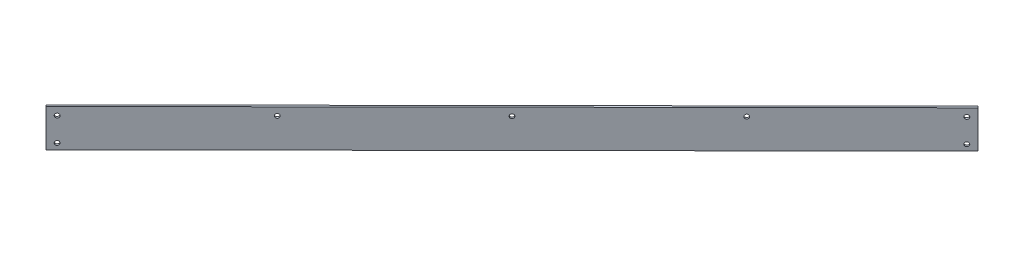
ISO-10303-21;
HEADER;
FILE_DESCRIPTION(('STEP AP214'),'2;1');
FILE_NAME('part.step','',(''),(''),'','','');
FILE_SCHEMA(('AUTOMOTIVE_DESIGN { 1 0 10303 214 1 1 1 1 }'));
ENDSEC;
DATA;
#1=APPLICATION_CONTEXT('core data for automotive mechanical design processes');
#2=APPLICATION_PROTOCOL_DEFINITION('international standard','automotive_design',2000,#1);
#3=PRODUCT_CONTEXT('',#1,'mechanical');
#4=PRODUCT('Part','Part','',(#3));
#5=PRODUCT_RELATED_PRODUCT_CATEGORY('part','',(#4));
#6=PRODUCT_DEFINITION_FORMATION('','',#4);
#7=PRODUCT_DEFINITION_CONTEXT('part definition',#1,'design');
#8=PRODUCT_DEFINITION('design','',#6,#7);
#9=PRODUCT_DEFINITION_SHAPE('','',#8);
#10=(LENGTH_UNIT() NAMED_UNIT(*) SI_UNIT(.MILLI.,.METRE.));
#11=(NAMED_UNIT(*) PLANE_ANGLE_UNIT() SI_UNIT($,.RADIAN.));
#12=(NAMED_UNIT(*) SI_UNIT($,.STERADIAN.) SOLID_ANGLE_UNIT());
#13=UNCERTAINTY_MEASURE_WITH_UNIT(LENGTH_MEASURE(1.E-05),#10,'distance_accuracy_value','');
#14=(GEOMETRIC_REPRESENTATION_CONTEXT(3) GLOBAL_UNCERTAINTY_ASSIGNED_CONTEXT((#13)) GLOBAL_UNIT_ASSIGNED_CONTEXT((#10,
#11,#12)) REPRESENTATION_CONTEXT('',''));
#15=CARTESIAN_POINT('',(0.,0.,0.));
#16=DIRECTION('',(0.,0.,1.));
#17=DIRECTION('',(1.,0.,0.));
#18=AXIS2_PLACEMENT_3D('',#15,#16,#17);
#19=CARTESIAN_POINT('',(-476.988429215037,30.1624999999951,-479.405792643321));
#20=DIRECTION('',(0.708891786097847,0.,-0.705317258829674));
#21=DIRECTION('',(0.,1.,0.));
#22=AXIS2_PLACEMENT_3D('',#19,#20,#21);
#23=PLANE('',#22);
#24=DIRECTION('',(0.705317258829674,0.,0.708891786097847));
#25=VECTOR('',#24,1.);
#26=CARTESIAN_POINT('',(-476.988429215037,60.3249999999965,-479.405792643321));
#27=LINE('',#26,#25);
#28=CARTESIAN_POINT('',(-478.10812036343,60.3249999999965,-480.531158353752));
#29=VERTEX_POINT('',#28);
#30=CARTESIAN_POINT('',(-475.868738066645,60.3249999999965,-478.280426932891));
#31=VERTEX_POINT('',#30);
#32=EDGE_CURVE('E12',#29,#31,#27,.T.);
#33=ORIENTED_EDGE('',*,*,#32,.F.);
#34=DIRECTION('',(0.,1.,0.));
#35=VECTOR('',#34,1.);
#36=CARTESIAN_POINT('',(-478.10812036343,30.1624999999951,-480.531158353752));
#37=LINE('',#36,#35);
#38=CARTESIAN_POINT('',(-478.10812036343,0.,-480.531158353752));
#39=VERTEX_POINT('',#38);
#40=EDGE_CURVE('E130',#29,#39,#37,.F.);
#41=ORIENTED_EDGE('',*,*,#40,.T.);
#42=DIRECTION('',(0.705317258829674,0.,0.708891786097847));
#43=VECTOR('',#42,1.);
#44=CARTESIAN_POINT('',(-476.988429215037,0.,-479.405792643321));
#45=LINE('',#44,#43);
#46=CARTESIAN_POINT('',(-475.868738066645,0.,-478.280426932891));
#47=VERTEX_POINT('',#46);
#48=EDGE_CURVE('E100',#39,#47,#45,.T.);
#49=ORIENTED_EDGE('',*,*,#48,.T.);
#50=DIRECTION('',(0.,1.,0.));
#51=VECTOR('',#50,1.);
#52=CARTESIAN_POINT('',(-475.868738066645,30.1624999999951,-478.280426932891));
#53=LINE('',#52,#51);
#54=EDGE_CURVE('E132',#31,#47,#53,.F.);
#55=ORIENTED_EDGE('',*,*,#54,.F.);
#56=EDGE_LOOP('',(#33,#41,#49,#55));
#57=FACE_BOUND('',#56,.T.);
#58=ADVANCED_FACE('F90',(#57),#23,.F.);
#59=CARTESIAN_POINT('',(-101.675734324953,0.,-852.826004804327));
#60=DIRECTION('',(0.,-1.,0.));
#61=DIRECTION('',(0.708891786097847,0.,-0.705317258829674));
#62=AXIS2_PLACEMENT_3D('',#59,#60,#61);
#63=PLANE('',#62);
#64=ORIENTED_EDGE('',*,*,#48,.F.);
#65=DIRECTION('',(0.708891786097847,0.,-0.705317258829674));
#66=VECTOR('',#65,1.);
#67=CARTESIAN_POINT('',(-102.795425473345,0.,-853.951370514758));
#68=LINE('',#67,#66);
#69=CARTESIAN_POINT('',(272.51726941674,0.,-1227.37158267576));
#70=VERTEX_POINT('',#69);
#71=EDGE_CURVE('E144',#39,#70,#68,.T.);
#72=ORIENTED_EDGE('',*,*,#71,.T.);
#73=DIRECTION('',(0.705317258829674,0.,0.708891786097847));
#74=VECTOR('',#73,1.);
#75=CARTESIAN_POINT('',(273.636960565132,0.,-1226.24621696533));
#76=LINE('',#75,#74);
#77=CARTESIAN_POINT('',(274.756651713524,0.,-1225.1208512549));
#78=VERTEX_POINT('',#77);
#79=EDGE_CURVE('E154',#70,#78,#76,.T.);
#80=ORIENTED_EDGE('',*,*,#79,.T.);
#81=DIRECTION('',(0.708891786097847,0.,-0.705317258829674));
#82=VECTOR('',#81,1.);
#83=CARTESIAN_POINT('',(-100.556043176561,0.,-851.700639093897));
#84=LINE('',#83,#82);
#85=EDGE_CURVE('E149',#47,#78,#84,.T.);
#86=ORIENTED_EDGE('',*,*,#85,.F.);
#87=EDGE_LOOP('',(#64,#72,#80,#86));
#88=FACE_BOUND('',#87,.T.);
#89=ADVANCED_FACE('F205',(#88),#63,.T.);
#90=CARTESIAN_POINT('',(273.636960565132,30.1624999999951,-1226.24621696533));
#91=DIRECTION('',(0.708891786097847,0.,-0.705317258829674));
#92=DIRECTION('',(0.,1.,0.));
#93=AXIS2_PLACEMENT_3D('',#90,#91,#92);
#94=PLANE('',#93);
#95=ORIENTED_EDGE('',*,*,#79,.F.);
#96=DIRECTION('',(0.,1.,0.));
#97=VECTOR('',#96,1.);
#98=CARTESIAN_POINT('',(272.51726941674,30.1624999999951,-1227.37158267576));
#99=LINE('',#98,#97);
#100=CARTESIAN_POINT('',(272.51726941674,60.3249999999965,-1227.37158267576));
#101=VERTEX_POINT('',#100);
#102=EDGE_CURVE('E147',#70,#101,#99,.T.);
#103=ORIENTED_EDGE('',*,*,#102,.T.);
#104=DIRECTION('',(0.705317258829674,0.,0.708891786097847));
#105=VECTOR('',#104,1.);
#106=CARTESIAN_POINT('',(273.636960565132,60.3249999999965,-1226.24621696533));
#107=LINE('',#106,#105);
#108=CARTESIAN_POINT('',(274.756651713524,60.3249999999965,-1225.1208512549));
#109=VERTEX_POINT('',#108);
#110=EDGE_CURVE('E109',#101,#109,#107,.T.);
#111=ORIENTED_EDGE('',*,*,#110,.T.);
#112=DIRECTION('',(0.,1.,0.));
#113=VECTOR('',#112,1.);
#114=CARTESIAN_POINT('',(274.756651713524,30.1624999999951,-1225.1208512549));
#115=LINE('',#114,#113);
#116=EDGE_CURVE('E200',#78,#109,#115,.T.);
#117=ORIENTED_EDGE('',*,*,#116,.F.);
#118=EDGE_LOOP('',(#95,#103,#111,#117));
#119=FACE_BOUND('',#118,.T.);
#120=ADVANCED_FACE('F209',(#119),#94,.T.);
#121=CARTESIAN_POINT('',(-101.675734324953,60.3249999999965,-852.826004804327));
#122=DIRECTION('',(0.,-1.,0.));
#123=DIRECTION('',(0.708891786097847,0.,-0.705317258829674));
#124=AXIS2_PLACEMENT_3D('',#121,#122,#123);
#125=PLANE('',#124);
#126=DIRECTION('',(0.708891786097847,0.,-0.705317258829674));
#127=VECTOR('',#126,1.);
#128=CARTESIAN_POINT('',(-102.795425473345,60.3249999999965,-853.951370514758));
#129=LINE('',#128,#127);
#130=EDGE_CURVE('E142',#101,#29,#129,.F.);
#131=ORIENTED_EDGE('',*,*,#130,.T.);
#132=ORIENTED_EDGE('',*,*,#32,.T.);
#133=DIRECTION('',(0.708891786097847,0.,-0.705317258829674));
#134=VECTOR('',#133,1.);
#135=CARTESIAN_POINT('',(-100.556043176561,60.3249999999965,-851.700639093897));
#136=LINE('',#135,#134);
#137=EDGE_CURVE('E158',#109,#31,#136,.F.);
#138=ORIENTED_EDGE('',*,*,#137,.F.);
#139=ORIENTED_EDGE('',*,*,#110,.F.);
#140=EDGE_LOOP('',(#131,#132,#138,#139));
#141=FACE_BOUND('',#140,.T.);
#142=ADVANCED_FACE('F92',(#141),#125,.F.);
#143=CARTESIAN_POINT('',(-100.556043176561,30.1624999999951,-851.700639093897));
#144=DIRECTION('',(0.705317258829674,0.,0.708891786097847));
#145=DIRECTION('',(0.708891786097847,0.,-0.705317258829674));
#146=AXIS2_PLACEMENT_3D('',#143,#144,#145);
#147=PLANE('',#146);
#148=CARTESIAN_POINT('',(-100.556043176561,47.6249999999969,-851.700639093897));
#149=DIRECTION('',(0.705317258829674,0.,0.708891786097847));
#150=DIRECTION('',(0.708891786097847,0.,-0.705317258829674));
#151=AXIS2_PLACEMENT_3D('',#148,#149,#150);
#152=CIRCLE('',#151,3.37819999999998);
#153=CARTESIAN_POINT('',(-98.1612649447651,47.6249999999969,-854.083341857676));
#154=VERTEX_POINT('',#153);
#155=EDGE_CURVE('E189',#154,#154,#152,.T.);
#156=ORIENTED_EDGE('',*,*,#155,.F.);
#157=EDGE_LOOP('',(#156));
#158=FACE_BOUND('',#157,.T.);
#159=CARTESIAN_POINT('',(-289.617482528856,47.6249999999969,-663.592526164023));
#160=DIRECTION('',(0.705317258829674,0.,0.708891786097847));
#161=DIRECTION('',(0.708891786097847,0.,-0.705317258829674));
#162=AXIS2_PLACEMENT_3D('',#159,#160,#161);
#163=CIRCLE('',#162,3.37819999999998);
#164=CARTESIAN_POINT('',(-287.222704297061,47.6249999999969,-665.975228927801));
#165=VERTEX_POINT('',#164);
#166=EDGE_CURVE('E179',#165,#165,#163,.T.);
#167=ORIENTED_EDGE('',*,*,#166,.F.);
#168=EDGE_LOOP('',(#167));
#169=FACE_BOUND('',#168,.T.);
#170=CARTESIAN_POINT('',(88.5053961757349,47.6249999999969,-1039.80875202377));
#171=DIRECTION('',(0.705317258829674,0.,0.708891786097847));
#172=DIRECTION('',(0.708891786097847,0.,-0.705317258829674));
#173=AXIS2_PLACEMENT_3D('',#170,#171,#172);
#174=CIRCLE('',#173,3.37819999999998);
#175=CARTESIAN_POINT('',(90.9001744075306,47.6249999999969,-1042.19145478755));
#176=VERTEX_POINT('',#175);
#177=EDGE_CURVE('E176',#176,#176,#174,.T.);
#178=ORIENTED_EDGE('',*,*,#177,.F.);
#179=EDGE_LOOP('',(#178));
#180=FACE_BOUND('',#179,.T.);
#181=CARTESIAN_POINT('',(-466.865812383203,47.6249999999966,-487.237956120028));
#182=DIRECTION('',(0.705317258829674,0.,0.708891786097847));
#183=DIRECTION('',(0.708891786097847,0.,-0.705317258829674));
#184=AXIS2_PLACEMENT_3D('',#181,#182,#183);
#185=CIRCLE('',#184,3.37819999999998);
#186=CARTESIAN_POINT('',(-464.471034151407,47.6249999999966,-489.620658883806));
#187=VERTEX_POINT('',#186);
#188=EDGE_CURVE('E173',#187,#187,#185,.T.);
#189=ORIENTED_EDGE('',*,*,#188,.F.);
#190=EDGE_LOOP('',(#189));
#191=FACE_BOUND('',#190,.T.);
#192=CARTESIAN_POINT('',(265.753726030082,47.6249999999966,-1216.16332206777));
#193=DIRECTION('',(0.705317258829674,0.,0.708891786097847));
#194=DIRECTION('',(0.708891786097847,0.,-0.705317258829674));
#195=AXIS2_PLACEMENT_3D('',#192,#193,#194);
#196=CIRCLE('',#195,3.37819999999998);
#197=CARTESIAN_POINT('',(268.148504261877,47.6249999999966,-1218.54602483154));
#198=VERTEX_POINT('',#197);
#199=EDGE_CURVE('E169',#198,#198,#196,.T.);
#200=ORIENTED_EDGE('',*,*,#199,.F.);
#201=EDGE_LOOP('',(#200));
#202=FACE_BOUND('',#201,.T.);
#203=CARTESIAN_POINT('',(-466.865812383203,9.5250000000026,-487.237956120028));
#204=DIRECTION('',(0.705317258829674,0.,0.708891786097847));
#205=DIRECTION('',(0.708891786097847,0.,-0.705317258829674));
#206=AXIS2_PLACEMENT_3D('',#203,#204,#205);
#207=CIRCLE('',#206,3.37819999999999);
#208=CARTESIAN_POINT('',(-464.471034151407,9.5250000000026,-489.620658883806));
#209=VERTEX_POINT('',#208);
#210=EDGE_CURVE('E165',#209,#209,#207,.T.);
#211=ORIENTED_EDGE('',*,*,#210,.F.);
#212=EDGE_LOOP('',(#211));
#213=FACE_BOUND('',#212,.T.);
#214=CARTESIAN_POINT('',(265.753726030082,9.5250000000026,-1216.16332206777));
#215=DIRECTION('',(0.705317258829674,0.,0.708891786097847));
#216=DIRECTION('',(0.708891786097847,0.,-0.705317258829674));
#217=AXIS2_PLACEMENT_3D('',#214,#215,#216);
#218=CIRCLE('',#217,3.37819999999999);
#219=CARTESIAN_POINT('',(268.148504261877,9.5250000000026,-1218.54602483154));
#220=VERTEX_POINT('',#219);
#221=EDGE_CURVE('E161',#220,#220,#218,.T.);
#222=ORIENTED_EDGE('',*,*,#221,.F.);
#223=EDGE_LOOP('',(#222));
#224=FACE_BOUND('',#223,.T.);
#225=ORIENTED_EDGE('',*,*,#116,.T.);
#226=ORIENTED_EDGE('',*,*,#137,.T.);
#227=ORIENTED_EDGE('',*,*,#54,.T.);
#228=ORIENTED_EDGE('',*,*,#85,.T.);
#229=EDGE_LOOP('',(#225,#226,#227,#228));
#230=FACE_BOUND('',#229,.T.);
#231=ADVANCED_FACE('F208',(#158,#169,#180,#191,#202,#213,#224,#230),#147,.T.);
#232=CARTESIAN_POINT('',(-102.795425473345,30.1624999999951,-853.951370514758));
#233=DIRECTION('',(0.705317258829674,0.,0.708891786097847));
#234=DIRECTION('',(0.708891786097847,0.,-0.705317258829674));
#235=AXIS2_PLACEMENT_3D('',#232,#233,#234);
#236=PLANE('',#235);
#237=CARTESIAN_POINT('',(-102.795425473345,47.6249999999969,-853.951370514758));
#238=DIRECTION('',(0.705317258829674,0.,0.708891786097847));
#239=DIRECTION('',(0.708891786097847,0.,-0.705317258829674));
#240=AXIS2_PLACEMENT_3D('',#237,#238,#239);
#241=CIRCLE('',#240,3.37819999999993);
#242=CARTESIAN_POINT('',(-100.400647241549,47.6249999999969,-856.334073278536));
#243=VERTEX_POINT('',#242);
#244=EDGE_CURVE('E94',#243,#243,#241,.T.);
#245=ORIENTED_EDGE('',*,*,#244,.T.);
#246=EDGE_LOOP('',(#245));
#247=FACE_BOUND('',#246,.T.);
#248=CARTESIAN_POINT('',(-291.856864825641,47.6249999999969,-665.843257584884));
#249=DIRECTION('',(0.705317258829674,0.,0.708891786097847));
#250=DIRECTION('',(0.708891786097847,0.,-0.705317258829674));
#251=AXIS2_PLACEMENT_3D('',#248,#249,#250);
#252=CIRCLE('',#251,3.37819999999993);
#253=CARTESIAN_POINT('',(-289.462086593845,47.6249999999969,-668.225960348662));
#254=VERTEX_POINT('',#253);
#255=EDGE_CURVE('E177',#254,#254,#252,.T.);
#256=ORIENTED_EDGE('',*,*,#255,.T.);
#257=EDGE_LOOP('',(#256));
#258=FACE_BOUND('',#257,.T.);
#259=CARTESIAN_POINT('',(86.2660138789509,47.6249999999969,-1042.05948344463));
#260=DIRECTION('',(0.705317258829674,0.,0.708891786097847));
#261=DIRECTION('',(0.708891786097847,0.,-0.705317258829674));
#262=AXIS2_PLACEMENT_3D('',#259,#260,#261);
#263=CIRCLE('',#262,3.37819999999993);
#264=CARTESIAN_POINT('',(88.6607921107466,47.6249999999969,-1044.44218620841));
#265=VERTEX_POINT('',#264);
#266=EDGE_CURVE('E174',#265,#265,#263,.T.);
#267=ORIENTED_EDGE('',*,*,#266,.T.);
#268=EDGE_LOOP('',(#267));
#269=FACE_BOUND('',#268,.T.);
#270=CARTESIAN_POINT('',(-469.105194679987,47.6249999999966,-489.488687540888));
#271=DIRECTION('',(0.705317258829674,0.,0.708891786097847));
#272=DIRECTION('',(0.708891786097847,0.,-0.705317258829674));
#273=AXIS2_PLACEMENT_3D('',#270,#271,#272);
#274=CIRCLE('',#273,3.37819999999993);
#275=CARTESIAN_POINT('',(-466.710416448191,47.6249999999966,-491.871390304667));
#276=VERTEX_POINT('',#275);
#277=EDGE_CURVE('E170',#276,#276,#274,.T.);
#278=ORIENTED_EDGE('',*,*,#277,.T.);
#279=EDGE_LOOP('',(#278));
#280=FACE_BOUND('',#279,.T.);
#281=CARTESIAN_POINT('',(263.514343733297,47.6249999999966,-1218.41405348863));
#282=DIRECTION('',(0.705317258829674,0.,0.708891786097847));
#283=DIRECTION('',(0.708891786097847,0.,-0.705317258829674));
#284=AXIS2_PLACEMENT_3D('',#281,#282,#283);
#285=CIRCLE('',#284,3.37819999999993);
#286=CARTESIAN_POINT('',(265.909121965093,47.6249999999966,-1220.79675625241));
#287=VERTEX_POINT('',#286);
#288=EDGE_CURVE('E166',#287,#287,#285,.T.);
#289=ORIENTED_EDGE('',*,*,#288,.T.);
#290=EDGE_LOOP('',(#289));
#291=FACE_BOUND('',#290,.T.);
#292=CARTESIAN_POINT('',(-469.105194679987,9.5250000000026,-489.488687540888));
#293=DIRECTION('',(0.705317258829674,0.,0.708891786097847));
#294=DIRECTION('',(0.708891786097847,0.,-0.705317258829674));
#295=AXIS2_PLACEMENT_3D('',#292,#293,#294);
#296=CIRCLE('',#295,3.37819999999993);
#297=CARTESIAN_POINT('',(-466.710416448191,9.5250000000026,-491.871390304667));
#298=VERTEX_POINT('',#297);
#299=EDGE_CURVE('E162',#298,#298,#296,.T.);
#300=ORIENTED_EDGE('',*,*,#299,.T.);
#301=EDGE_LOOP('',(#300));
#302=FACE_BOUND('',#301,.T.);
#303=CARTESIAN_POINT('',(263.514343733297,9.5250000000026,-1218.41405348863));
#304=DIRECTION('',(0.705317258829674,0.,0.708891786097847));
#305=DIRECTION('',(0.708891786097847,0.,-0.705317258829674));
#306=AXIS2_PLACEMENT_3D('',#303,#304,#305);
#307=CIRCLE('',#306,3.37819999999993);
#308=CARTESIAN_POINT('',(265.909121965093,9.5250000000026,-1220.79675625241));
#309=VERTEX_POINT('',#308);
#310=EDGE_CURVE('E145',#309,#309,#307,.T.);
#311=ORIENTED_EDGE('',*,*,#310,.T.);
#312=EDGE_LOOP('',(#311));
#313=FACE_BOUND('',#312,.T.);
#314=ORIENTED_EDGE('',*,*,#102,.F.);
#315=ORIENTED_EDGE('',*,*,#71,.F.);
#316=ORIENTED_EDGE('',*,*,#40,.F.);
#317=ORIENTED_EDGE('',*,*,#130,.F.);
#318=EDGE_LOOP('',(#314,#315,#316,#317));
#319=FACE_BOUND('',#318,.T.);
#320=ADVANCED_FACE('F141',(#247,#258,#269,#280,#291,#302,#313,#319),#236,.F.);
#321=CARTESIAN_POINT('',(265.753726030082,9.5250000000026,-1216.16332206777));
#322=DIRECTION('',(0.705317258829674,0.,0.708891786097847));
#323=DIRECTION('',(0.708891786097847,0.,-0.705317258829674));
#324=AXIS2_PLACEMENT_3D('',#321,#322,#323);
#325=CYLINDRICAL_SURFACE('',#324,3.37819999999993);
#326=ORIENTED_EDGE('',*,*,#221,.T.);
#327=EDGE_LOOP('',(#326));
#328=FACE_BOUND('',#327,.T.);
#329=ORIENTED_EDGE('',*,*,#310,.F.);
#330=EDGE_LOOP('',(#329));
#331=FACE_BOUND('',#330,.T.);
#332=ADVANCED_FACE('F256',(#328,#331),#325,.F.);
#333=CARTESIAN_POINT('',(-466.865812383203,9.5250000000026,-487.237956120028));
#334=DIRECTION('',(0.705317258829674,0.,0.708891786097847));
#335=DIRECTION('',(0.708891786097847,0.,-0.705317258829674));
#336=AXIS2_PLACEMENT_3D('',#333,#334,#335);
#337=CYLINDRICAL_SURFACE('',#336,3.37819999999993);
#338=ORIENTED_EDGE('',*,*,#210,.T.);
#339=EDGE_LOOP('',(#338));
#340=FACE_BOUND('',#339,.T.);
#341=ORIENTED_EDGE('',*,*,#299,.F.);
#342=EDGE_LOOP('',(#341));
#343=FACE_BOUND('',#342,.T.);
#344=ADVANCED_FACE('F266',(#340,#343),#337,.F.);
#345=CARTESIAN_POINT('',(265.753726030082,47.6249999999966,-1216.16332206777));
#346=DIRECTION('',(0.705317258829674,0.,0.708891786097847));
#347=DIRECTION('',(0.708891786097847,0.,-0.705317258829674));
#348=AXIS2_PLACEMENT_3D('',#345,#346,#347);
#349=CYLINDRICAL_SURFACE('',#348,3.37819999999993);
#350=ORIENTED_EDGE('',*,*,#199,.T.);
#351=EDGE_LOOP('',(#350));
#352=FACE_BOUND('',#351,.T.);
#353=ORIENTED_EDGE('',*,*,#288,.F.);
#354=EDGE_LOOP('',(#353));
#355=FACE_BOUND('',#354,.T.);
#356=ADVANCED_FACE('F277',(#352,#355),#349,.F.);
#357=CARTESIAN_POINT('',(-466.865812383203,47.6249999999966,-487.237956120028));
#358=DIRECTION('',(0.705317258829674,0.,0.708891786097847));
#359=DIRECTION('',(0.708891786097847,0.,-0.705317258829674));
#360=AXIS2_PLACEMENT_3D('',#357,#358,#359);
#361=CYLINDRICAL_SURFACE('',#360,3.37819999999993);
#362=ORIENTED_EDGE('',*,*,#188,.T.);
#363=EDGE_LOOP('',(#362));
#364=FACE_BOUND('',#363,.T.);
#365=ORIENTED_EDGE('',*,*,#277,.F.);
#366=EDGE_LOOP('',(#365));
#367=FACE_BOUND('',#366,.T.);
#368=ADVANCED_FACE('F288',(#364,#367),#361,.F.);
#369=CARTESIAN_POINT('',(88.5053961757349,47.6249999999969,-1039.80875202377));
#370=DIRECTION('',(0.705317258829674,0.,0.708891786097847));
#371=DIRECTION('',(0.708891786097847,0.,-0.705317258829674));
#372=AXIS2_PLACEMENT_3D('',#369,#370,#371);
#373=CYLINDRICAL_SURFACE('',#372,3.37819999999993);
#374=ORIENTED_EDGE('',*,*,#177,.T.);
#375=EDGE_LOOP('',(#374));
#376=FACE_BOUND('',#375,.T.);
#377=ORIENTED_EDGE('',*,*,#266,.F.);
#378=EDGE_LOOP('',(#377));
#379=FACE_BOUND('',#378,.T.);
#380=ADVANCED_FACE('F299',(#376,#379),#373,.F.);
#381=CARTESIAN_POINT('',(-289.617482528856,47.6249999999969,-663.592526164023));
#382=DIRECTION('',(0.705317258829674,0.,0.708891786097847));
#383=DIRECTION('',(0.708891786097847,0.,-0.705317258829674));
#384=AXIS2_PLACEMENT_3D('',#381,#382,#383);
#385=CYLINDRICAL_SURFACE('',#384,3.37819999999993);
#386=ORIENTED_EDGE('',*,*,#166,.T.);
#387=EDGE_LOOP('',(#386));
#388=FACE_BOUND('',#387,.T.);
#389=ORIENTED_EDGE('',*,*,#255,.F.);
#390=EDGE_LOOP('',(#389));
#391=FACE_BOUND('',#390,.T.);
#392=ADVANCED_FACE('F310',(#388,#391),#385,.F.);
#393=CARTESIAN_POINT('',(-100.556043176561,47.6249999999969,-851.700639093897));
#394=DIRECTION('',(0.705317258829674,0.,0.708891786097847));
#395=DIRECTION('',(0.708891786097847,0.,-0.705317258829674));
#396=AXIS2_PLACEMENT_3D('',#393,#394,#395);
#397=CYLINDRICAL_SURFACE('',#396,3.37819999999993);
#398=ORIENTED_EDGE('',*,*,#155,.T.);
#399=EDGE_LOOP('',(#398));
#400=FACE_BOUND('',#399,.T.);
#401=ORIENTED_EDGE('',*,*,#244,.F.);
#402=EDGE_LOOP('',(#401));
#403=FACE_BOUND('',#402,.T.);
#404=ADVANCED_FACE('F321',(#400,#403),#397,.F.);
#405=CLOSED_SHELL('',(#58,#89,#120,#142,#231,#320,#332,#344,#356,#368,#380,#392,#404));
#406=MANIFOLD_SOLID_BREP('B2',#405);
#407=ADVANCED_BREP_SHAPE_REPRESENTATION('',(#18,#406),#14);
#408=SHAPE_DEFINITION_REPRESENTATION(#9,#407);
ENDSEC;
END-ISO-10303-21;
